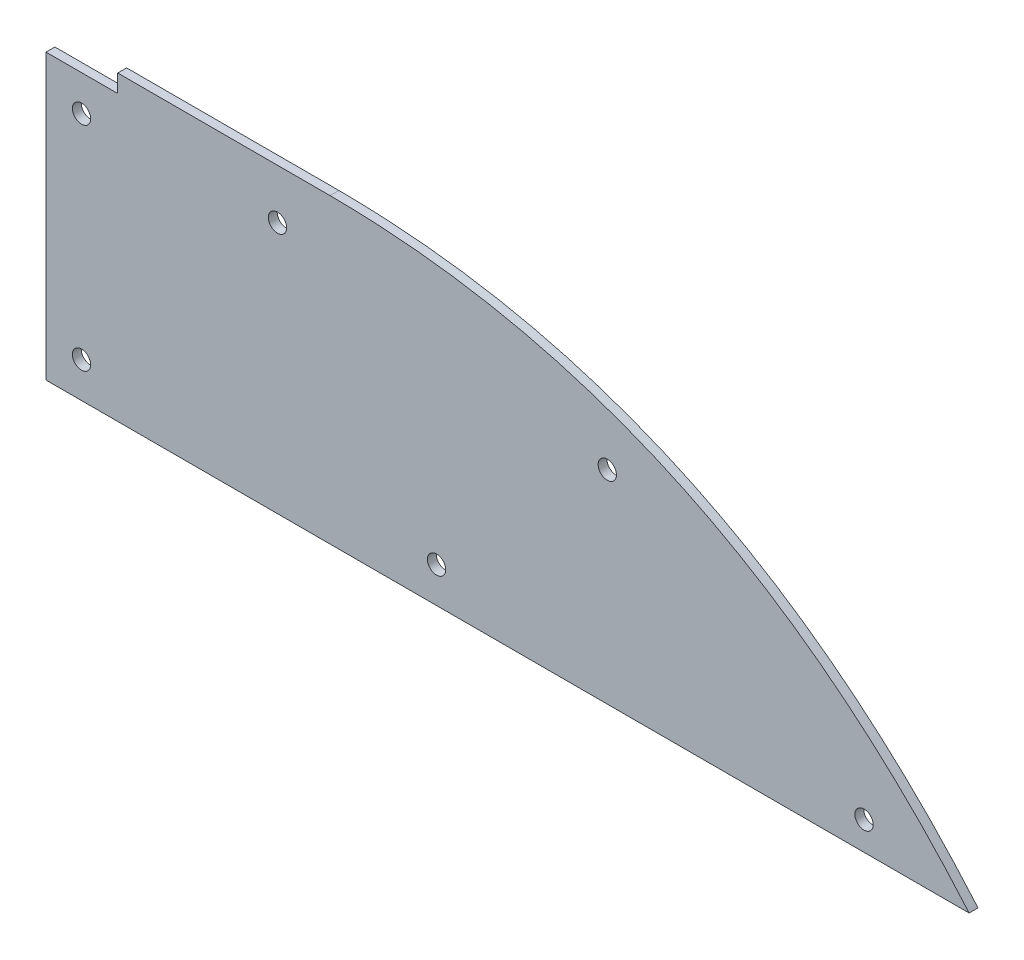
ISO-10303-21;
HEADER;
FILE_DESCRIPTION(('STEP AP214'),'2;1');
FILE_NAME('part.step','',(''),(''),'','','');
FILE_SCHEMA(('AUTOMOTIVE_DESIGN { 1 0 10303 214 1 1 1 1 }'));
ENDSEC;
DATA;
#1=APPLICATION_CONTEXT('core data for automotive mechanical design processes');
#2=APPLICATION_PROTOCOL_DEFINITION('international standard','automotive_design',2000,#1);
#3=PRODUCT_CONTEXT('',#1,'mechanical');
#4=PRODUCT('Part','Part','',(#3));
#5=PRODUCT_RELATED_PRODUCT_CATEGORY('part','',(#4));
#6=PRODUCT_DEFINITION_FORMATION('','',#4);
#7=PRODUCT_DEFINITION_CONTEXT('part definition',#1,'design');
#8=PRODUCT_DEFINITION('design','',#6,#7);
#9=PRODUCT_DEFINITION_SHAPE('','',#8);
#10=(LENGTH_UNIT() NAMED_UNIT(*) SI_UNIT(.MILLI.,.METRE.));
#11=(NAMED_UNIT(*) PLANE_ANGLE_UNIT() SI_UNIT($,.RADIAN.));
#12=(NAMED_UNIT(*) SI_UNIT($,.STERADIAN.) SOLID_ANGLE_UNIT());
#13=UNCERTAINTY_MEASURE_WITH_UNIT(LENGTH_MEASURE(1.E-05),#10,'distance_accuracy_value','');
#14=(GEOMETRIC_REPRESENTATION_CONTEXT(3) GLOBAL_UNCERTAINTY_ASSIGNED_CONTEXT((#13)) GLOBAL_UNIT_ASSIGNED_CONTEXT((#10,
#11,#12)) REPRESENTATION_CONTEXT('',''));
#15=CARTESIAN_POINT('',(0.,0.,0.));
#16=DIRECTION('',(0.,0.,1.));
#17=DIRECTION('',(1.,0.,0.));
#18=AXIS2_PLACEMENT_3D('',#15,#16,#17);
#19=CARTESIAN_POINT('',(584.2,0.,0.));
#20=DIRECTION('',(-1.,0.,0.));
#21=DIRECTION('',(0.,0.,1.));
#22=AXIS2_PLACEMENT_3D('',#19,#20,#21);
#23=PLANE('',#22);
#24=DIRECTION('',(0.,-1.,0.));
#25=VECTOR('',#24,1.);
#26=CARTESIAN_POINT('',(584.2,76.2,3.175));
#27=LINE('',#26,#25);
#28=CARTESIAN_POINT('',(584.2,101.6,3.175));
#29=VERTEX_POINT('',#28);
#30=CARTESIAN_POINT('',(584.2,0.,3.175));
#31=VERTEX_POINT('',#30);
#32=EDGE_CURVE('E42',#29,#31,#27,.T.);
#33=ORIENTED_EDGE('',*,*,#32,.F.);
#34=DIRECTION('',(0.,0.,-1.));
#35=VECTOR('',#34,1.);
#36=CARTESIAN_POINT('',(584.2,101.6,0.));
#37=LINE('',#36,#35);
#38=CARTESIAN_POINT('',(584.2,101.6,0.));
#39=VERTEX_POINT('',#38);
#40=EDGE_CURVE('E11',#29,#39,#37,.T.);
#41=ORIENTED_EDGE('',*,*,#40,.T.);
#42=DIRECTION('',(0.,1.,0.));
#43=VECTOR('',#42,1.);
#44=CARTESIAN_POINT('',(584.2,80.6674906682584,0.));
#45=LINE('',#44,#43);
#46=CARTESIAN_POINT('',(584.2,0.,0.));
#47=VERTEX_POINT('',#46);
#48=EDGE_CURVE('E196',#47,#39,#45,.T.);
#49=ORIENTED_EDGE('',*,*,#48,.F.);
#50=DIRECTION('',(0.,0.,1.));
#51=VECTOR('',#50,1.);
#52=CARTESIAN_POINT('',(584.2,0.,3.175));
#53=LINE('',#52,#51);
#54=EDGE_CURVE('E47',#47,#31,#53,.T.);
#55=ORIENTED_EDGE('',*,*,#54,.T.);
#56=EDGE_LOOP('',(#33,#41,#49,#55));
#57=FACE_BOUND('',#56,.T.);
#58=ADVANCED_FACE('F39',(#57),#23,.T.);
#59=CARTESIAN_POINT('',(914.4,0.,3.175));
#60=CARTESIAN_POINT('',(823.003997346706,107.359981336517,3.175));
#61=CARTESIAN_POINT('',(685.8,107.95,3.175));
#62=B_SPLINE_CURVE_WITH_KNOTS('',2,(#59,#60,#61),.UNSPECIFIED.,.F.,.F.,(3,3),(0.,1.),.UNSPECIFIED.);
#63=DIRECTION('',(0.,0.,-1.));
#64=VECTOR('',#63,1.);
#65=SURFACE_OF_LINEAR_EXTRUSION('',#62,#64);
#66=CARTESIAN_POINT('',(914.4,0.,0.));
#67=CARTESIAN_POINT('',(823.003997346706,107.359981336517,0.));
#68=CARTESIAN_POINT('',(685.8,107.95,0.));
#69=B_SPLINE_CURVE_WITH_KNOTS('',2,(#66,#67,#68),.UNSPECIFIED.,.F.,.F.,(3,3),(0.,1.),.UNSPECIFIED.);
#70=CARTESIAN_POINT('',(914.4,0.,0.));
#71=VERTEX_POINT('',#70);
#72=CARTESIAN_POINT('',(685.8,107.95,0.));
#73=VERTEX_POINT('',#72);
#74=EDGE_CURVE('E100',#71,#73,#69,.T.);
#75=ORIENTED_EDGE('',*,*,#74,.T.);
#76=DIRECTION('',(0.,0.,-1.));
#77=VECTOR('',#76,1.);
#78=CARTESIAN_POINT('',(685.8,107.95,3.175));
#79=LINE('',#78,#77);
#80=CARTESIAN_POINT('',(685.8,107.95,3.175));
#81=VERTEX_POINT('',#80);
#82=EDGE_CURVE('E113',#81,#73,#79,.T.);
#83=ORIENTED_EDGE('',*,*,#82,.F.);
#84=CARTESIAN_POINT('',(914.4,0.,3.175));
#85=VERTEX_POINT('',#84);
#86=EDGE_CURVE('E123',#85,#81,#62,.T.);
#87=ORIENTED_EDGE('',*,*,#86,.F.);
#88=DIRECTION('',(0.,0.,-1.));
#89=VECTOR('',#88,1.);
#90=CARTESIAN_POINT('',(914.4,0.,3.175));
#91=LINE('',#90,#89);
#92=EDGE_CURVE('E116',#85,#71,#91,.T.);
#93=ORIENTED_EDGE('',*,*,#92,.T.);
#94=EDGE_LOOP('',(#75,#83,#87,#93));
#95=FACE_BOUND('',#94,.T.);
#96=ADVANCED_FACE('F111',(#95),#65,.F.);
#97=CARTESIAN_POINT('',(0.,107.95,3.175));
#98=DIRECTION('',(0.,-1.,0.));
#99=DIRECTION('',(1.,0.,0.));
#100=AXIS2_PLACEMENT_3D('',#97,#98,#99);
#101=PLANE('',#100);
#102=DIRECTION('',(-1.,0.,0.));
#103=VECTOR('',#102,1.);
#104=CARTESIAN_POINT('',(0.,107.95,0.));
#105=LINE('',#104,#103);
#106=CARTESIAN_POINT('',(609.854,107.95,0.));
#107=VERTEX_POINT('',#106);
#108=EDGE_CURVE('E96',#73,#107,#105,.T.);
#109=ORIENTED_EDGE('',*,*,#108,.T.);
#110=DIRECTION('',(0.,0.,1.));
#111=VECTOR('',#110,1.);
#112=CARTESIAN_POINT('',(609.854,107.95,0.));
#113=LINE('',#112,#111);
#114=CARTESIAN_POINT('',(609.854,107.95,3.175));
#115=VERTEX_POINT('',#114);
#116=EDGE_CURVE('E117',#107,#115,#113,.T.);
#117=ORIENTED_EDGE('',*,*,#116,.T.);
#118=DIRECTION('',(-1.,0.,0.));
#119=VECTOR('',#118,1.);
#120=CARTESIAN_POINT('',(609.6,107.95,3.175));
#121=LINE('',#120,#119);
#122=EDGE_CURVE('E121',#81,#115,#121,.T.);
#123=ORIENTED_EDGE('',*,*,#122,.F.);
#124=ORIENTED_EDGE('',*,*,#82,.T.);
#125=EDGE_LOOP('',(#109,#117,#123,#124));
#126=FACE_BOUND('',#125,.T.);
#127=ADVANCED_FACE('F119',(#126),#101,.F.);
#128=CARTESIAN_POINT('',(0.,0.,3.175));
#129=DIRECTION('',(0.,1.,0.));
#130=DIRECTION('',(-1.,0.,0.));
#131=AXIS2_PLACEMENT_3D('',#128,#129,#130);
#132=PLANE('',#131);
#133=ORIENTED_EDGE('',*,*,#54,.F.);
#134=DIRECTION('',(1.,0.,0.));
#135=VECTOR('',#134,1.);
#136=CARTESIAN_POINT('',(0.,0.,0.));
#137=LINE('',#136,#135);
#138=EDGE_CURVE('E106',#47,#71,#137,.T.);
#139=ORIENTED_EDGE('',*,*,#138,.T.);
#140=ORIENTED_EDGE('',*,*,#92,.F.);
#141=DIRECTION('',(1.,0.,0.));
#142=VECTOR('',#141,1.);
#143=CARTESIAN_POINT('',(0.,0.,3.175));
#144=LINE('',#143,#142);
#145=EDGE_CURVE('E127',#31,#85,#144,.T.);
#146=ORIENTED_EDGE('',*,*,#145,.F.);
#147=EDGE_LOOP('',(#133,#139,#140,#146));
#148=FACE_BOUND('',#147,.T.);
#149=ADVANCED_FACE('F179',(#148),#132,.F.);
#150=CARTESIAN_POINT('',(876.808000000189,10.1599999999449,0.));
#151=DIRECTION('',(0.,0.,1.));
#152=DIRECTION('',(1.,0.,0.));
#153=AXIS2_PLACEMENT_3D('',#150,#151,#152);
#154=CYLINDRICAL_SURFACE('',#153,3.27499999999996);
#155=CARTESIAN_POINT('',(876.808000000189,10.1599999999449,0.));
#156=DIRECTION('',(0.,0.,-1.));
#157=DIRECTION('',(-1.,0.,0.));
#158=AXIS2_PLACEMENT_3D('',#155,#156,#157);
#159=CIRCLE('',#158,3.27499999999996);
#160=CARTESIAN_POINT('',(873.53300000019,10.1599999999449,0.));
#161=VERTEX_POINT('',#160);
#162=EDGE_CURVE('E233',#161,#161,#159,.T.);
#163=ORIENTED_EDGE('',*,*,#162,.T.);
#164=EDGE_LOOP('',(#163));
#165=FACE_BOUND('',#164,.T.);
#166=CARTESIAN_POINT('',(876.808000000189,10.1599999999449,3.175));
#167=DIRECTION('',(0.,0.,-1.));
#168=DIRECTION('',(-1.,0.,0.));
#169=AXIS2_PLACEMENT_3D('',#166,#167,#168);
#170=CIRCLE('',#169,3.27499999999996);
#171=CARTESIAN_POINT('',(873.53300000019,10.1599999999449,3.175));
#172=VERTEX_POINT('',#171);
#173=EDGE_CURVE('E224',#172,#172,#170,.F.);
#174=ORIENTED_EDGE('',*,*,#173,.T.);
#175=EDGE_LOOP('',(#174));
#176=FACE_BOUND('',#175,.T.);
#177=ADVANCED_FACE('F175',(#165,#176),#154,.F.);
#178=CARTESIAN_POINT('',(784.965808452393,72.6222695788124,0.));
#179=DIRECTION('',(0.,0.,1.));
#180=DIRECTION('',(1.,0.,0.));
#181=AXIS2_PLACEMENT_3D('',#178,#179,#180);
#182=CYLINDRICAL_SURFACE('',#181,3.27499999999999);
#183=CARTESIAN_POINT('',(784.965808452393,72.6222695788124,0.));
#184=DIRECTION('',(0.,0.,-1.));
#185=DIRECTION('',(-1.,0.,0.));
#186=AXIS2_PLACEMENT_3D('',#183,#184,#185);
#187=CIRCLE('',#186,3.27499999999999);
#188=CARTESIAN_POINT('',(781.690808452393,72.6222695788124,0.));
#189=VERTEX_POINT('',#188);
#190=EDGE_CURVE('E237',#189,#189,#187,.T.);
#191=ORIENTED_EDGE('',*,*,#190,.T.);
#192=EDGE_LOOP('',(#191));
#193=FACE_BOUND('',#192,.T.);
#194=CARTESIAN_POINT('',(784.965808452393,72.6222695788124,3.175));
#195=DIRECTION('',(0.,0.,-1.));
#196=DIRECTION('',(-1.,0.,0.));
#197=AXIS2_PLACEMENT_3D('',#194,#195,#196);
#198=CIRCLE('',#197,3.27499999999999);
#199=CARTESIAN_POINT('',(781.690808452393,72.6222695788124,3.175));
#200=VERTEX_POINT('',#199);
#201=EDGE_CURVE('E227',#200,#200,#198,.F.);
#202=ORIENTED_EDGE('',*,*,#201,.T.);
#203=EDGE_LOOP('',(#202));
#204=FACE_BOUND('',#203,.T.);
#205=ADVANCED_FACE('F171',(#193,#204),#182,.F.);
#206=CARTESIAN_POINT('',(667.004,90.1701915203067,0.));
#207=DIRECTION('',(0.,0.,1.));
#208=DIRECTION('',(1.,0.,0.));
#209=AXIS2_PLACEMENT_3D('',#206,#207,#208);
#210=CYLINDRICAL_SURFACE('',#209,3.27500000000001);
#211=CARTESIAN_POINT('',(667.004,90.1701915203067,0.));
#212=DIRECTION('',(0.,0.,-1.));
#213=DIRECTION('',(-1.,0.,0.));
#214=AXIS2_PLACEMENT_3D('',#211,#212,#213);
#215=CIRCLE('',#214,3.27500000000001);
#216=CARTESIAN_POINT('',(663.729,90.1701915203067,0.));
#217=VERTEX_POINT('',#216);
#218=EDGE_CURVE('E234',#217,#217,#215,.T.);
#219=ORIENTED_EDGE('',*,*,#218,.T.);
#220=EDGE_LOOP('',(#219));
#221=FACE_BOUND('',#220,.T.);
#222=CARTESIAN_POINT('',(667.004,90.1701915203067,3.175));
#223=DIRECTION('',(0.,0.,-1.));
#224=DIRECTION('',(-1.,0.,0.));
#225=AXIS2_PLACEMENT_3D('',#222,#223,#224);
#226=CIRCLE('',#225,3.27500000000001);
#227=CARTESIAN_POINT('',(663.729,90.1701915203067,3.175));
#228=VERTEX_POINT('',#227);
#229=EDGE_CURVE('E230',#228,#228,#226,.F.);
#230=ORIENTED_EDGE('',*,*,#229,.T.);
#231=EDGE_LOOP('',(#230));
#232=FACE_BOUND('',#231,.T.);
#233=ADVANCED_FACE('F167',(#221,#232),#210,.F.);
#234=CARTESIAN_POINT('',(723.9,12.7,12.7));
#235=DIRECTION('',(0.,0.,-1.));
#236=DIRECTION('',(-1.,0.,0.));
#237=AXIS2_PLACEMENT_3D('',#234,#235,#236);
#238=CYLINDRICAL_SURFACE('',#237,3.27500000000002);
#239=CARTESIAN_POINT('',(723.9,12.7,0.));
#240=DIRECTION('',(0.,0.,-1.));
#241=DIRECTION('',(-1.,0.,0.));
#242=AXIS2_PLACEMENT_3D('',#239,#240,#241);
#243=CIRCLE('',#242,3.27500000000002);
#244=CARTESIAN_POINT('',(720.625,12.7,0.));
#245=VERTEX_POINT('',#244);
#246=EDGE_CURVE('E219',#245,#245,#243,.T.);
#247=ORIENTED_EDGE('',*,*,#246,.T.);
#248=EDGE_LOOP('',(#247));
#249=FACE_BOUND('',#248,.T.);
#250=CARTESIAN_POINT('',(723.9,12.7,3.175));
#251=DIRECTION('',(0.,0.,-1.));
#252=DIRECTION('',(-1.,0.,0.));
#253=AXIS2_PLACEMENT_3D('',#250,#251,#252);
#254=CIRCLE('',#253,3.27500000000002);
#255=CARTESIAN_POINT('',(720.625,12.7,3.175));
#256=VERTEX_POINT('',#255);
#257=EDGE_CURVE('E199',#256,#256,#254,.T.);
#258=ORIENTED_EDGE('',*,*,#257,.F.);
#259=EDGE_LOOP('',(#258));
#260=FACE_BOUND('',#259,.T.);
#261=ADVANCED_FACE('F163',(#249,#260),#238,.F.);
#262=CARTESIAN_POINT('',(596.9,88.9,12.7));
#263=DIRECTION('',(0.,0.,-1.));
#264=DIRECTION('',(-1.,0.,0.));
#265=AXIS2_PLACEMENT_3D('',#262,#263,#264);
#266=CYLINDRICAL_SURFACE('',#265,3.27500000000002);
#267=CARTESIAN_POINT('',(596.9,88.9,0.));
#268=DIRECTION('',(0.,0.,-1.));
#269=DIRECTION('',(-1.,0.,0.));
#270=AXIS2_PLACEMENT_3D('',#267,#268,#269);
#271=CIRCLE('',#270,3.27500000000002);
#272=CARTESIAN_POINT('',(593.625,88.9,0.));
#273=VERTEX_POINT('',#272);
#274=EDGE_CURVE('E215',#273,#273,#271,.T.);
#275=ORIENTED_EDGE('',*,*,#274,.T.);
#276=EDGE_LOOP('',(#275));
#277=FACE_BOUND('',#276,.T.);
#278=CARTESIAN_POINT('',(596.9,88.9,3.175));
#279=DIRECTION('',(0.,0.,-1.));
#280=DIRECTION('',(-1.,0.,0.));
#281=AXIS2_PLACEMENT_3D('',#278,#279,#280);
#282=CIRCLE('',#281,3.27500000000002);
#283=CARTESIAN_POINT('',(593.625,88.9,3.175));
#284=VERTEX_POINT('',#283);
#285=EDGE_CURVE('E209',#284,#284,#282,.T.);
#286=ORIENTED_EDGE('',*,*,#285,.F.);
#287=EDGE_LOOP('',(#286));
#288=FACE_BOUND('',#287,.T.);
#289=ADVANCED_FACE('F159',(#277,#288),#266,.F.);
#290=CARTESIAN_POINT('',(596.9,12.7,12.7));
#291=DIRECTION('',(0.,0.,-1.));
#292=DIRECTION('',(-1.,0.,0.));
#293=AXIS2_PLACEMENT_3D('',#290,#291,#292);
#294=CYLINDRICAL_SURFACE('',#293,3.27500000000002);
#295=CARTESIAN_POINT('',(596.9,12.7,0.));
#296=DIRECTION('',(0.,0.,-1.));
#297=DIRECTION('',(-1.,0.,0.));
#298=AXIS2_PLACEMENT_3D('',#295,#296,#297);
#299=CIRCLE('',#298,3.27500000000002);
#300=CARTESIAN_POINT('',(593.625,12.7,0.));
#301=VERTEX_POINT('',#300);
#302=EDGE_CURVE('E216',#301,#301,#299,.T.);
#303=ORIENTED_EDGE('',*,*,#302,.T.);
#304=EDGE_LOOP('',(#303));
#305=FACE_BOUND('',#304,.T.);
#306=CARTESIAN_POINT('',(596.9,12.7,3.175));
#307=DIRECTION('',(0.,0.,-1.));
#308=DIRECTION('',(-1.,0.,0.));
#309=AXIS2_PLACEMENT_3D('',#306,#307,#308);
#310=CIRCLE('',#309,3.27500000000002);
#311=CARTESIAN_POINT('',(593.625,12.7,3.175));
#312=VERTEX_POINT('',#311);
#313=EDGE_CURVE('E212',#312,#312,#310,.T.);
#314=ORIENTED_EDGE('',*,*,#313,.F.);
#315=EDGE_LOOP('',(#314));
#316=FACE_BOUND('',#315,.T.);
#317=ADVANCED_FACE('F148',(#305,#316),#294,.F.);
#318=CARTESIAN_POINT('',(811.551998673353,80.6674906682584,0.));
#319=DIRECTION('',(0.,0.,-1.));
#320=DIRECTION('',(-1.,0.,0.));
#321=AXIS2_PLACEMENT_3D('',#318,#319,#320);
#322=PLANE('',#321);
#323=ORIENTED_EDGE('',*,*,#302,.F.);
#324=EDGE_LOOP('',(#323));
#325=FACE_BOUND('',#324,.T.);
#326=ORIENTED_EDGE('',*,*,#274,.F.);
#327=EDGE_LOOP('',(#326));
#328=FACE_BOUND('',#327,.T.);
#329=ORIENTED_EDGE('',*,*,#246,.F.);
#330=EDGE_LOOP('',(#329));
#331=FACE_BOUND('',#330,.T.);
#332=ORIENTED_EDGE('',*,*,#218,.F.);
#333=EDGE_LOOP('',(#332));
#334=FACE_BOUND('',#333,.T.);
#335=ORIENTED_EDGE('',*,*,#190,.F.);
#336=EDGE_LOOP('',(#335));
#337=FACE_BOUND('',#336,.T.);
#338=ORIENTED_EDGE('',*,*,#162,.F.);
#339=EDGE_LOOP('',(#338));
#340=FACE_BOUND('',#339,.T.);
#341=ORIENTED_EDGE('',*,*,#138,.F.);
#342=ORIENTED_EDGE('',*,*,#48,.T.);
#343=DIRECTION('',(1.,0.,0.));
#344=VECTOR('',#343,1.);
#345=CARTESIAN_POINT('',(-0.254,101.6,0.));
#346=LINE('',#345,#344);
#347=CARTESIAN_POINT('',(609.854,101.6,0.));
#348=VERTEX_POINT('',#347);
#349=EDGE_CURVE('E63',#39,#348,#346,.T.);
#350=ORIENTED_EDGE('',*,*,#349,.T.);
#351=DIRECTION('',(0.,1.,0.));
#352=VECTOR('',#351,1.);
#353=CARTESIAN_POINT('',(609.854,107.95,0.));
#354=LINE('',#353,#352);
#355=EDGE_CURVE('E102',#348,#107,#354,.T.);
#356=ORIENTED_EDGE('',*,*,#355,.T.);
#357=ORIENTED_EDGE('',*,*,#108,.F.);
#358=ORIENTED_EDGE('',*,*,#74,.F.);
#359=EDGE_LOOP('',(#341,#342,#350,#356,#357,#358));
#360=FACE_BOUND('',#359,.T.);
#361=ADVANCED_FACE('F99',(#325,#328,#331,#334,#337,#340,#360),#322,.T.);
#362=CARTESIAN_POINT('',(609.854,107.95,0.));
#363=DIRECTION('',(1.,0.,0.));
#364=DIRECTION('',(0.,0.,-1.));
#365=AXIS2_PLACEMENT_3D('',#362,#363,#364);
#366=PLANE('',#365);
#367=DIRECTION('',(0.,1.,0.));
#368=VECTOR('',#367,1.);
#369=CARTESIAN_POINT('',(609.854,107.95,3.175));
#370=LINE('',#369,#368);
#371=CARTESIAN_POINT('',(609.854,101.6,3.175));
#372=VERTEX_POINT('',#371);
#373=EDGE_CURVE('E200',#372,#115,#370,.T.);
#374=ORIENTED_EDGE('',*,*,#373,.T.);
#375=ORIENTED_EDGE('',*,*,#116,.F.);
#376=ORIENTED_EDGE('',*,*,#355,.F.);
#377=DIRECTION('',(0.,0.,1.));
#378=VECTOR('',#377,1.);
#379=CARTESIAN_POINT('',(609.854,101.6,0.));
#380=LINE('',#379,#378);
#381=EDGE_CURVE('E198',#348,#372,#380,.T.);
#382=ORIENTED_EDGE('',*,*,#381,.T.);
#383=EDGE_LOOP('',(#374,#375,#376,#382));
#384=FACE_BOUND('',#383,.T.);
#385=ADVANCED_FACE('F147',(#384),#366,.F.);
#386=CARTESIAN_POINT('',(-1.929,76.2,3.175));
#387=DIRECTION('',(0.,0.,1.));
#388=DIRECTION('',(1.,0.,0.));
#389=AXIS2_PLACEMENT_3D('',#386,#387,#388);
#390=PLANE('',#389);
#391=ORIENTED_EDGE('',*,*,#313,.T.);
#392=EDGE_LOOP('',(#391));
#393=FACE_BOUND('',#392,.T.);
#394=ORIENTED_EDGE('',*,*,#285,.T.);
#395=EDGE_LOOP('',(#394));
#396=FACE_BOUND('',#395,.T.);
#397=ORIENTED_EDGE('',*,*,#257,.T.);
#398=EDGE_LOOP('',(#397));
#399=FACE_BOUND('',#398,.T.);
#400=ORIENTED_EDGE('',*,*,#229,.F.);
#401=EDGE_LOOP('',(#400));
#402=FACE_BOUND('',#401,.T.);
#403=ORIENTED_EDGE('',*,*,#201,.F.);
#404=EDGE_LOOP('',(#403));
#405=FACE_BOUND('',#404,.T.);
#406=ORIENTED_EDGE('',*,*,#173,.F.);
#407=EDGE_LOOP('',(#406));
#408=FACE_BOUND('',#407,.T.);
#409=DIRECTION('',(1.,0.,0.));
#410=VECTOR('',#409,1.);
#411=CARTESIAN_POINT('',(609.6,101.6,3.175));
#412=LINE('',#411,#410);
#413=EDGE_CURVE('E55',#29,#372,#412,.T.);
#414=ORIENTED_EDGE('',*,*,#413,.F.);
#415=ORIENTED_EDGE('',*,*,#32,.T.);
#416=ORIENTED_EDGE('',*,*,#145,.T.);
#417=ORIENTED_EDGE('',*,*,#86,.T.);
#418=ORIENTED_EDGE('',*,*,#122,.T.);
#419=ORIENTED_EDGE('',*,*,#373,.F.);
#420=EDGE_LOOP('',(#414,#415,#416,#417,#418,#419));
#421=FACE_BOUND('',#420,.T.);
#422=ADVANCED_FACE('F153',(#393,#396,#399,#402,#405,#408,#421),#390,.T.);
#423=CARTESIAN_POINT('',(609.6,101.6,0.));
#424=DIRECTION('',(0.,-1.,0.));
#425=DIRECTION('',(0.,0.,-1.));
#426=AXIS2_PLACEMENT_3D('',#423,#424,#425);
#427=PLANE('',#426);
#428=ORIENTED_EDGE('',*,*,#40,.F.);
#429=ORIENTED_EDGE('',*,*,#413,.T.);
#430=ORIENTED_EDGE('',*,*,#381,.F.);
#431=ORIENTED_EDGE('',*,*,#349,.F.);
#432=EDGE_LOOP('',(#428,#429,#430,#431));
#433=FACE_BOUND('',#432,.T.);
#434=ADVANCED_FACE('F150',(#433),#427,.F.);
#435=CLOSED_SHELL('',(#58,#96,#127,#149,#177,#205,#233,#261,#289,#317,#361,#385,#422,#434));
#436=MANIFOLD_SOLID_BREP('B2',#435);
#437=ADVANCED_BREP_SHAPE_REPRESENTATION('',(#18,#436),#14);
#438=SHAPE_DEFINITION_REPRESENTATION(#9,#437);
ENDSEC;
END-ISO-10303-21;
